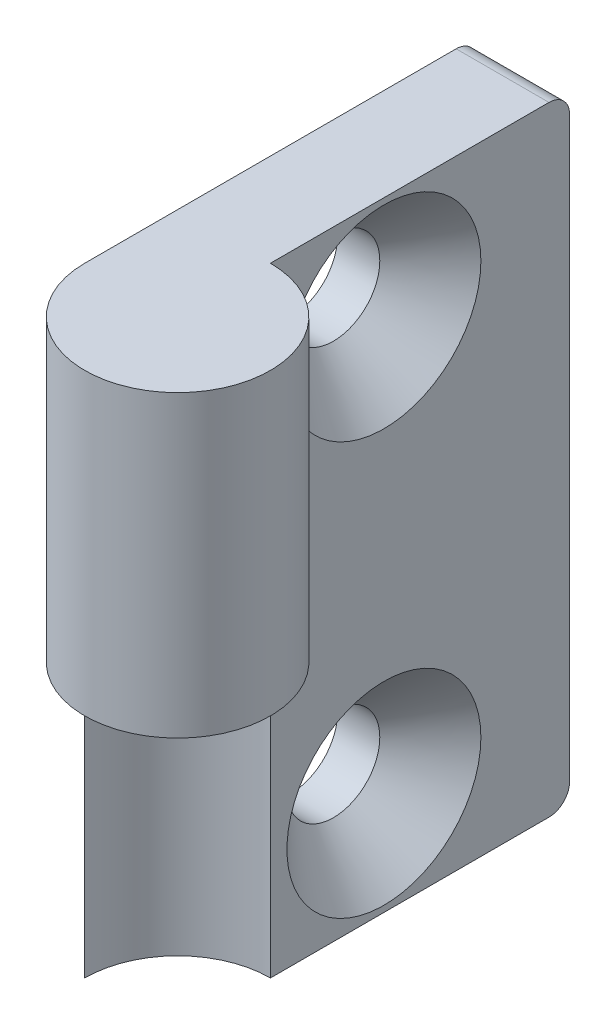
ISO-10303-21;
HEADER;
FILE_DESCRIPTION(('STEP AP214'),'2;1');
FILE_NAME('part.step','',(''),(''),'','','');
FILE_SCHEMA(('AUTOMOTIVE_DESIGN { 1 0 10303 214 1 1 1 1 }'));
ENDSEC;
DATA;
#1=APPLICATION_CONTEXT('core data for automotive mechanical design processes');
#2=APPLICATION_PROTOCOL_DEFINITION('international standard','automotive_design',2000,#1);
#3=PRODUCT_CONTEXT('',#1,'mechanical');
#4=PRODUCT('Part','Part','',(#3));
#5=PRODUCT_RELATED_PRODUCT_CATEGORY('part','',(#4));
#6=PRODUCT_DEFINITION_FORMATION('','',#4);
#7=PRODUCT_DEFINITION_CONTEXT('part definition',#1,'design');
#8=PRODUCT_DEFINITION('design','',#6,#7);
#9=PRODUCT_DEFINITION_SHAPE('','',#8);
#10=(LENGTH_UNIT() NAMED_UNIT(*) SI_UNIT(.MILLI.,.METRE.));
#11=(NAMED_UNIT(*) PLANE_ANGLE_UNIT() SI_UNIT($,.RADIAN.));
#12=(NAMED_UNIT(*) SI_UNIT($,.STERADIAN.) SOLID_ANGLE_UNIT());
#13=UNCERTAINTY_MEASURE_WITH_UNIT(LENGTH_MEASURE(1.E-05),#10,'distance_accuracy_value','');
#14=(GEOMETRIC_REPRESENTATION_CONTEXT(3) GLOBAL_UNCERTAINTY_ASSIGNED_CONTEXT((#13)) GLOBAL_UNIT_ASSIGNED_CONTEXT((#10,
#11,#12)) REPRESENTATION_CONTEXT('',''));
#15=CARTESIAN_POINT('',(0.,0.,0.));
#16=DIRECTION('',(0.,0.,1.));
#17=DIRECTION('',(1.,0.,0.));
#18=AXIS2_PLACEMENT_3D('',#15,#16,#17);
#19=CARTESIAN_POINT('',(4.5,0.,0.));
#20=DIRECTION('',(-1.,0.,0.));
#21=DIRECTION('',(0.,0.,1.));
#22=AXIS2_PLACEMENT_3D('',#19,#20,#21);
#23=PLANE('',#22);
#24=CARTESIAN_POINT('',(4.5,5.,-10.));
#25=DIRECTION('',(1.,0.,0.));
#26=DIRECTION('',(0.,0.,-1.));
#27=AXIS2_PLACEMENT_3D('',#24,#25,#26);
#28=CIRCLE('',#27,4.7);
#29=CARTESIAN_POINT('',(4.5,5.,-14.7));
#30=VERTEX_POINT('',#29);
#31=EDGE_CURVE('E173',#30,#30,#28,.T.);
#32=ORIENTED_EDGE('',*,*,#31,.F.);
#33=EDGE_LOOP('',(#32));
#34=FACE_BOUND('',#33,.T.);
#35=DIRECTION('',(0.,0.,-1.));
#36=VECTOR('',#35,1.);
#37=CARTESIAN_POINT('',(4.5,0.,0.));
#38=LINE('',#37,#36);
#39=CARTESIAN_POINT('',(4.5,0.,-4.5));
#40=VERTEX_POINT('',#39);
#41=CARTESIAN_POINT('',(4.5,0.,-18.));
#42=VERTEX_POINT('',#41);
#43=EDGE_CURVE('E107',#40,#42,#38,.T.);
#44=ORIENTED_EDGE('',*,*,#43,.T.);
#45=CARTESIAN_POINT('',(4.5,1.,-18.));
#46=DIRECTION('',(-1.,0.,0.));
#47=DIRECTION('',(0.,0.,1.));
#48=AXIS2_PLACEMENT_3D('',#45,#46,#47);
#49=CIRCLE('',#48,1.);
#50=CARTESIAN_POINT('',(4.5,1.,-19.));
#51=VERTEX_POINT('',#50);
#52=EDGE_CURVE('E41',#42,#51,#49,.F.);
#53=ORIENTED_EDGE('',*,*,#52,.T.);
#54=DIRECTION('',(0.,1.,0.));
#55=VECTOR('',#54,1.);
#56=CARTESIAN_POINT('',(4.5,0.,-19.));
#57=LINE('',#56,#55);
#58=CARTESIAN_POINT('',(4.5,29.,-19.));
#59=VERTEX_POINT('',#58);
#60=EDGE_CURVE('E115',#51,#59,#57,.T.);
#61=ORIENTED_EDGE('',*,*,#60,.T.);
#62=CARTESIAN_POINT('',(4.5,29.,-18.));
#63=DIRECTION('',(-1.,0.,0.));
#64=DIRECTION('',(0.,0.,1.));
#65=AXIS2_PLACEMENT_3D('',#62,#63,#64);
#66=CIRCLE('',#65,1.);
#67=CARTESIAN_POINT('',(4.5,30.,-18.));
#68=VERTEX_POINT('',#67);
#69=EDGE_CURVE('E48',#59,#68,#66,.F.);
#70=ORIENTED_EDGE('',*,*,#69,.T.);
#71=DIRECTION('',(0.,0.,1.));
#72=VECTOR('',#71,1.);
#73=CARTESIAN_POINT('',(4.5,30.,0.));
#74=LINE('',#73,#72);
#75=CARTESIAN_POINT('',(4.5,30.,-4.5));
#76=VERTEX_POINT('',#75);
#77=EDGE_CURVE('E118',#68,#76,#74,.T.);
#78=ORIENTED_EDGE('',*,*,#77,.T.);
#79=DIRECTION('',(0.,1.,0.));
#80=VECTOR('',#79,1.);
#81=CARTESIAN_POINT('',(4.5,15.5,-4.5));
#82=LINE('',#81,#80);
#83=CARTESIAN_POINT('',(4.5,15.5,-4.5));
#84=VERTEX_POINT('',#83);
#85=EDGE_CURVE('E110',#76,#84,#82,.F.);
#86=ORIENTED_EDGE('',*,*,#85,.T.);
#87=DIRECTION('',(0.,-1.,0.));
#88=VECTOR('',#87,1.);
#89=CARTESIAN_POINT('',(4.5,28.2279220613579,-4.5));
#90=LINE('',#89,#88);
#91=EDGE_CURVE('E97',#40,#84,#90,.F.);
#92=ORIENTED_EDGE('',*,*,#91,.F.);
#93=EDGE_LOOP('',(#44,#53,#61,#70,#78,#86,#92));
#94=FACE_BOUND('',#93,.T.);
#95=CARTESIAN_POINT('',(4.5,25.,-10.));
#96=DIRECTION('',(1.,0.,0.));
#97=DIRECTION('',(0.,0.,-1.));
#98=AXIS2_PLACEMENT_3D('',#95,#96,#97);
#99=CIRCLE('',#98,4.7);
#100=CARTESIAN_POINT('',(4.5,25.,-14.7));
#101=VERTEX_POINT('',#100);
#102=EDGE_CURVE('E182',#101,#101,#99,.T.);
#103=ORIENTED_EDGE('',*,*,#102,.F.);
#104=EDGE_LOOP('',(#103));
#105=FACE_BOUND('',#104,.T.);
#106=ADVANCED_FACE('F33',(#34,#94,#105),#23,.F.);
#107=CARTESIAN_POINT('',(4.5,0.,0.));
#108=DIRECTION('',(0.,1.,0.));
#109=DIRECTION('',(0.,0.,1.));
#110=AXIS2_PLACEMENT_3D('',#107,#108,#109);
#111=PLANE('',#110);
#112=DIRECTION('',(0.,0.,-1.));
#113=VECTOR('',#112,1.);
#114=CARTESIAN_POINT('',(0.,0.,0.));
#115=LINE('',#114,#113);
#116=CARTESIAN_POINT('',(0.,0.,0.));
#117=VERTEX_POINT('',#116);
#118=CARTESIAN_POINT('',(0.,0.,-18.));
#119=VERTEX_POINT('',#118);
#120=EDGE_CURVE('E130',#117,#119,#115,.T.);
#121=ORIENTED_EDGE('',*,*,#120,.T.);
#122=DIRECTION('',(-1.,0.,0.));
#123=VECTOR('',#122,1.);
#124=CARTESIAN_POINT('',(4.5,0.,-18.));
#125=LINE('',#124,#123);
#126=EDGE_CURVE('E56',#119,#42,#125,.F.);
#127=ORIENTED_EDGE('',*,*,#126,.T.);
#128=ORIENTED_EDGE('',*,*,#43,.F.);
#129=CARTESIAN_POINT('',(4.5,0.,0.));
#130=DIRECTION('',(0.,1.,0.));
#131=DIRECTION('',(0.,0.,1.));
#132=AXIS2_PLACEMENT_3D('',#129,#130,#131);
#133=CIRCLE('',#132,4.5);
#134=EDGE_CURVE('E94',#40,#117,#133,.T.);
#135=ORIENTED_EDGE('',*,*,#134,.T.);
#136=EDGE_LOOP('',(#121,#127,#128,#135));
#137=FACE_BOUND('',#136,.T.);
#138=ADVANCED_FACE('F114',(#137),#111,.F.);
#139=CARTESIAN_POINT('',(4.5,0.,-19.));
#140=DIRECTION('',(0.,0.,1.));
#141=DIRECTION('',(1.,0.,0.));
#142=AXIS2_PLACEMENT_3D('',#139,#140,#141);
#143=PLANE('',#142);
#144=ORIENTED_EDGE('',*,*,#60,.F.);
#145=DIRECTION('',(-1.,0.,0.));
#146=VECTOR('',#145,1.);
#147=CARTESIAN_POINT('',(4.5,1.,-19.));
#148=LINE('',#147,#146);
#149=CARTESIAN_POINT('',(0.,1.,-19.));
#150=VERTEX_POINT('',#149);
#151=EDGE_CURVE('E135',#51,#150,#148,.T.);
#152=ORIENTED_EDGE('',*,*,#151,.T.);
#153=DIRECTION('',(0.,1.,0.));
#154=VECTOR('',#153,1.);
#155=CARTESIAN_POINT('',(0.,0.,-19.));
#156=LINE('',#155,#154);
#157=CARTESIAN_POINT('',(0.,29.,-19.));
#158=VERTEX_POINT('',#157);
#159=EDGE_CURVE('E120',#150,#158,#156,.T.);
#160=ORIENTED_EDGE('',*,*,#159,.T.);
#161=DIRECTION('',(-1.,0.,0.));
#162=VECTOR('',#161,1.);
#163=CARTESIAN_POINT('',(4.5,29.,-19.));
#164=LINE('',#163,#162);
#165=EDGE_CURVE('E126',#158,#59,#164,.F.);
#166=ORIENTED_EDGE('',*,*,#165,.T.);
#167=EDGE_LOOP('',(#144,#152,#160,#166));
#168=FACE_BOUND('',#167,.T.);
#169=ADVANCED_FACE('F147',(#168),#143,.F.);
#170=CARTESIAN_POINT('',(4.5,30.,0.));
#171=DIRECTION('',(0.,-1.,0.));
#172=DIRECTION('',(0.,0.,-1.));
#173=AXIS2_PLACEMENT_3D('',#170,#171,#172);
#174=PLANE('',#173);
#175=ORIENTED_EDGE('',*,*,#77,.F.);
#176=DIRECTION('',(-1.,0.,0.));
#177=VECTOR('',#176,1.);
#178=CARTESIAN_POINT('',(4.5,30.,-18.));
#179=LINE('',#178,#177);
#180=CARTESIAN_POINT('',(0.,30.,-18.));
#181=VERTEX_POINT('',#180);
#182=EDGE_CURVE('E11',#68,#181,#179,.T.);
#183=ORIENTED_EDGE('',*,*,#182,.T.);
#184=DIRECTION('',(0.,0.,1.));
#185=VECTOR('',#184,1.);
#186=CARTESIAN_POINT('',(0.,30.,0.));
#187=LINE('',#186,#185);
#188=CARTESIAN_POINT('',(0.,30.,0.));
#189=VERTEX_POINT('',#188);
#190=EDGE_CURVE('E116',#181,#189,#187,.T.);
#191=ORIENTED_EDGE('',*,*,#190,.T.);
#192=CARTESIAN_POINT('',(4.5,30.,0.));
#193=DIRECTION('',(0.,1.,0.));
#194=DIRECTION('',(0.,0.,1.));
#195=AXIS2_PLACEMENT_3D('',#192,#193,#194);
#196=CIRCLE('',#195,4.5);
#197=EDGE_CURVE('E112',#189,#76,#196,.T.);
#198=ORIENTED_EDGE('',*,*,#197,.T.);
#199=EDGE_LOOP('',(#175,#183,#191,#198));
#200=FACE_BOUND('',#199,.T.);
#201=ADVANCED_FACE('F157',(#200),#174,.F.);
#202=CARTESIAN_POINT('',(0.,0.,0.));
#203=DIRECTION('',(-1.,0.,0.));
#204=DIRECTION('',(0.,0.,1.));
#205=AXIS2_PLACEMENT_3D('',#202,#203,#204);
#206=PLANE('',#205);
#207=CARTESIAN_POINT('',(0.,25.,-10.));
#208=DIRECTION('',(-1.,0.,0.));
#209=DIRECTION('',(0.,0.,1.));
#210=AXIS2_PLACEMENT_3D('',#207,#208,#209);
#211=CIRCLE('',#210,2.25);
#212=CARTESIAN_POINT('',(0.,25.,-7.75));
#213=VERTEX_POINT('',#212);
#214=EDGE_CURVE('E176',#213,#213,#211,.T.);
#215=ORIENTED_EDGE('',*,*,#214,.F.);
#216=EDGE_LOOP('',(#215));
#217=FACE_BOUND('',#216,.T.);
#218=CARTESIAN_POINT('',(0.,5.,-10.));
#219=DIRECTION('',(-1.,0.,0.));
#220=DIRECTION('',(0.,0.,1.));
#221=AXIS2_PLACEMENT_3D('',#218,#219,#220);
#222=CIRCLE('',#221,2.25);
#223=CARTESIAN_POINT('',(0.,5.,-7.75));
#224=VERTEX_POINT('',#223);
#225=EDGE_CURVE('E103',#224,#224,#222,.T.);
#226=ORIENTED_EDGE('',*,*,#225,.F.);
#227=EDGE_LOOP('',(#226));
#228=FACE_BOUND('',#227,.T.);
#229=ORIENTED_EDGE('',*,*,#159,.F.);
#230=CARTESIAN_POINT('',(0.,1.,-18.));
#231=DIRECTION('',(-1.,0.,0.));
#232=DIRECTION('',(0.,0.,1.));
#233=AXIS2_PLACEMENT_3D('',#230,#231,#232);
#234=CIRCLE('',#233,1.);
#235=EDGE_CURVE('E140',#150,#119,#234,.T.);
#236=ORIENTED_EDGE('',*,*,#235,.T.);
#237=ORIENTED_EDGE('',*,*,#120,.F.);
#238=DIRECTION('',(0.,-1.,0.));
#239=VECTOR('',#238,1.);
#240=CARTESIAN_POINT('',(0.,0.,0.));
#241=LINE('',#240,#239);
#242=CARTESIAN_POINT('',(0.,15.5,0.));
#243=VERTEX_POINT('',#242);
#244=EDGE_CURVE('E100',#243,#117,#241,.T.);
#245=ORIENTED_EDGE('',*,*,#244,.F.);
#246=EDGE_CURVE('E127',#189,#243,#241,.T.);
#247=ORIENTED_EDGE('',*,*,#246,.F.);
#248=ORIENTED_EDGE('',*,*,#190,.F.);
#249=CARTESIAN_POINT('',(0.,29.,-18.));
#250=DIRECTION('',(-1.,0.,0.));
#251=DIRECTION('',(0.,0.,1.));
#252=AXIS2_PLACEMENT_3D('',#249,#250,#251);
#253=CIRCLE('',#252,1.);
#254=EDGE_CURVE('E138',#181,#158,#253,.T.);
#255=ORIENTED_EDGE('',*,*,#254,.T.);
#256=EDGE_LOOP('',(#229,#236,#237,#245,#247,#248,#255));
#257=FACE_BOUND('',#256,.T.);
#258=ADVANCED_FACE('F152',(#217,#228,#257),#206,.T.);
#259=CARTESIAN_POINT('',(4.5,15.5,0.));
#260=DIRECTION('',(0.,1.,0.));
#261=DIRECTION('',(0.,0.,1.));
#262=AXIS2_PLACEMENT_3D('',#259,#260,#261);
#263=CYLINDRICAL_SURFACE('',#262,4.5);
#264=ORIENTED_EDGE('',*,*,#85,.F.);
#265=ORIENTED_EDGE('',*,*,#197,.F.);
#266=ORIENTED_EDGE('',*,*,#246,.T.);
#267=CARTESIAN_POINT('',(4.5,15.5,0.));
#268=DIRECTION('',(0.,1.,0.));
#269=DIRECTION('',(0.,0.,1.));
#270=AXIS2_PLACEMENT_3D('',#267,#268,#269);
#271=CIRCLE('',#270,4.5);
#272=EDGE_CURVE('E164',#243,#84,#271,.T.);
#273=ORIENTED_EDGE('',*,*,#272,.T.);
#274=EDGE_LOOP('',(#264,#265,#266,#273));
#275=FACE_BOUND('',#274,.T.);
#276=ADVANCED_FACE('F163',(#275),#263,.T.);
#277=CARTESIAN_POINT('',(4.5,15.5,0.));
#278=DIRECTION('',(0.,1.,0.));
#279=DIRECTION('',(0.,0.,1.));
#280=AXIS2_PLACEMENT_3D('',#277,#278,#279);
#281=PLANE('',#280);
#282=ORIENTED_EDGE('',*,*,#272,.F.);
#283=CARTESIAN_POINT('',(4.5,15.5,0.));
#284=DIRECTION('',(0.,1.,0.));
#285=DIRECTION('',(0.,0.,1.));
#286=AXIS2_PLACEMENT_3D('',#283,#284,#285);
#287=CIRCLE('',#286,4.5);
#288=EDGE_CURVE('E102',#84,#243,#287,.T.);
#289=ORIENTED_EDGE('',*,*,#288,.F.);
#290=EDGE_LOOP('',(#282,#289));
#291=FACE_BOUND('',#290,.T.);
#292=ADVANCED_FACE('F210',(#291),#281,.F.);
#293=CARTESIAN_POINT('',(4.5,28.2279220613579,0.));
#294=DIRECTION('',(0.,-1.,0.));
#295=DIRECTION('',(0.,0.,-1.));
#296=AXIS2_PLACEMENT_3D('',#293,#294,#295);
#297=CYLINDRICAL_SURFACE('',#296,4.5);
#298=ORIENTED_EDGE('',*,*,#91,.T.);
#299=ORIENTED_EDGE('',*,*,#288,.T.);
#300=ORIENTED_EDGE('',*,*,#244,.T.);
#301=ORIENTED_EDGE('',*,*,#134,.F.);
#302=EDGE_LOOP('',(#298,#299,#300,#301));
#303=FACE_BOUND('',#302,.T.);
#304=ADVANCED_FACE('F96',(#303),#297,.F.);
#305=CARTESIAN_POINT('',(4.5,1.,-18.));
#306=DIRECTION('',(-1.,0.,0.));
#307=DIRECTION('',(0.,0.,1.));
#308=AXIS2_PLACEMENT_3D('',#305,#306,#307);
#309=CYLINDRICAL_SURFACE('',#308,1.);
#310=ORIENTED_EDGE('',*,*,#52,.F.);
#311=ORIENTED_EDGE('',*,*,#126,.F.);
#312=ORIENTED_EDGE('',*,*,#235,.F.);
#313=ORIENTED_EDGE('',*,*,#151,.F.);
#314=EDGE_LOOP('',(#310,#311,#312,#313));
#315=FACE_BOUND('',#314,.T.);
#316=ADVANCED_FACE('F150',(#315),#309,.T.);
#317=CARTESIAN_POINT('',(4.5,29.,-18.));
#318=DIRECTION('',(-1.,0.,0.));
#319=DIRECTION('',(0.,0.,1.));
#320=AXIS2_PLACEMENT_3D('',#317,#318,#319);
#321=CYLINDRICAL_SURFACE('',#320,1.);
#322=ORIENTED_EDGE('',*,*,#69,.F.);
#323=ORIENTED_EDGE('',*,*,#165,.F.);
#324=ORIENTED_EDGE('',*,*,#254,.F.);
#325=ORIENTED_EDGE('',*,*,#182,.F.);
#326=EDGE_LOOP('',(#322,#323,#324,#325));
#327=FACE_BOUND('',#326,.T.);
#328=ADVANCED_FACE('F35',(#327),#321,.T.);
#329=CARTESIAN_POINT('',(4.5,5.,-10.));
#330=DIRECTION('',(1.,0.,0.));
#331=DIRECTION('',(0.,0.,-1.));
#332=AXIS2_PLACEMENT_3D('',#329,#330,#331);
#333=CYLINDRICAL_SURFACE('',#332,2.25);
#334=CARTESIAN_POINT('',(2.05,5.,-10.));
#335=DIRECTION('',(1.,0.,0.));
#336=DIRECTION('',(0.,0.,-1.));
#337=AXIS2_PLACEMENT_3D('',#334,#335,#336);
#338=CIRCLE('',#337,2.25);
#339=CARTESIAN_POINT('',(2.05,5.,-12.25));
#340=VERTEX_POINT('',#339);
#341=EDGE_CURVE('E170',#340,#340,#338,.T.);
#342=ORIENTED_EDGE('',*,*,#341,.T.);
#343=EDGE_LOOP('',(#342));
#344=FACE_BOUND('',#343,.T.);
#345=ORIENTED_EDGE('',*,*,#225,.T.);
#346=EDGE_LOOP('',(#345));
#347=FACE_BOUND('',#346,.T.);
#348=ADVANCED_FACE('F209',(#344,#347),#333,.F.);
#349=CARTESIAN_POINT('',(4.5,5.,-10.));
#350=DIRECTION('',(1.,0.,0.));
#351=DIRECTION('',(0.,0.,-1.));
#352=AXIS2_PLACEMENT_3D('',#349,#350,#351);
#353=CONICAL_SURFACE('',#352,4.7,0.785398163397448);
#354=ORIENTED_EDGE('',*,*,#341,.F.);
#355=EDGE_LOOP('',(#354));
#356=FACE_BOUND('',#355,.T.);
#357=ORIENTED_EDGE('',*,*,#31,.T.);
#358=EDGE_LOOP('',(#357));
#359=FACE_BOUND('',#358,.T.);
#360=ADVANCED_FACE('F219',(#356,#359),#353,.F.);
#361=CARTESIAN_POINT('',(4.5,25.,-10.));
#362=DIRECTION('',(1.,0.,0.));
#363=DIRECTION('',(0.,0.,-1.));
#364=AXIS2_PLACEMENT_3D('',#361,#362,#363);
#365=CYLINDRICAL_SURFACE('',#364,2.25);
#366=CARTESIAN_POINT('',(2.05,25.,-10.));
#367=DIRECTION('',(1.,0.,0.));
#368=DIRECTION('',(0.,0.,-1.));
#369=AXIS2_PLACEMENT_3D('',#366,#367,#368);
#370=CIRCLE('',#369,2.25);
#371=CARTESIAN_POINT('',(2.05,25.,-12.25));
#372=VERTEX_POINT('',#371);
#373=EDGE_CURVE('E179',#372,#372,#370,.T.);
#374=ORIENTED_EDGE('',*,*,#373,.T.);
#375=EDGE_LOOP('',(#374));
#376=FACE_BOUND('',#375,.T.);
#377=ORIENTED_EDGE('',*,*,#214,.T.);
#378=EDGE_LOOP('',(#377));
#379=FACE_BOUND('',#378,.T.);
#380=ADVANCED_FACE('F223',(#376,#379),#365,.F.);
#381=CARTESIAN_POINT('',(4.5,25.,-10.));
#382=DIRECTION('',(1.,0.,0.));
#383=DIRECTION('',(0.,0.,-1.));
#384=AXIS2_PLACEMENT_3D('',#381,#382,#383);
#385=CONICAL_SURFACE('',#384,4.7,0.785398163397447);
#386=ORIENTED_EDGE('',*,*,#373,.F.);
#387=EDGE_LOOP('',(#386));
#388=FACE_BOUND('',#387,.T.);
#389=ORIENTED_EDGE('',*,*,#102,.T.);
#390=EDGE_LOOP('',(#389));
#391=FACE_BOUND('',#390,.T.);
#392=ADVANCED_FACE('F186',(#388,#391),#385,.F.);
#393=CLOSED_SHELL('',(#106,#138,#169,#201,#258,#276,#292,#304,#316,#328,#348,#360,#380,#392));
#394=MANIFOLD_SOLID_BREP('B2',#393);
#395=ADVANCED_BREP_SHAPE_REPRESENTATION('',(#18,#394),#14);
#396=SHAPE_DEFINITION_REPRESENTATION(#9,#395);
ENDSEC;
END-ISO-10303-21;
